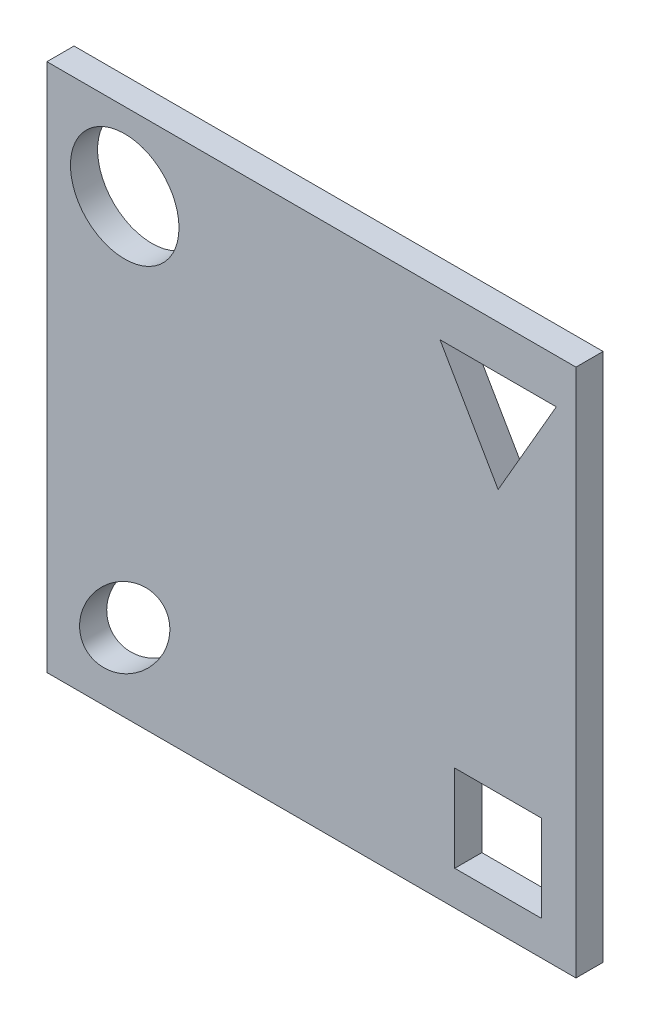
ISO-10303-21;
HEADER;
FILE_DESCRIPTION(('STEP AP214'),'2;1');
FILE_NAME('part.step','',(''),(''),'','','');
FILE_SCHEMA(('AUTOMOTIVE_DESIGN { 1 0 10303 214 1 1 1 1 }'));
ENDSEC;
DATA;
#1=APPLICATION_CONTEXT('core data for automotive mechanical design processes');
#2=APPLICATION_PROTOCOL_DEFINITION('international standard','automotive_design',2000,#1);
#3=PRODUCT_CONTEXT('',#1,'mechanical');
#4=PRODUCT('Part','Part','',(#3));
#5=PRODUCT_RELATED_PRODUCT_CATEGORY('part','',(#4));
#6=PRODUCT_DEFINITION_FORMATION('','',#4);
#7=PRODUCT_DEFINITION_CONTEXT('part definition',#1,'design');
#8=PRODUCT_DEFINITION('design','',#6,#7);
#9=PRODUCT_DEFINITION_SHAPE('','',#8);
#10=(LENGTH_UNIT() NAMED_UNIT(*) SI_UNIT(.MILLI.,.METRE.));
#11=(NAMED_UNIT(*) PLANE_ANGLE_UNIT() SI_UNIT($,.RADIAN.));
#12=(NAMED_UNIT(*) SI_UNIT($,.STERADIAN.) SOLID_ANGLE_UNIT());
#13=UNCERTAINTY_MEASURE_WITH_UNIT(LENGTH_MEASURE(1.E-05),#10,'distance_accuracy_value','');
#14=(GEOMETRIC_REPRESENTATION_CONTEXT(3) GLOBAL_UNCERTAINTY_ASSIGNED_CONTEXT((#13)) GLOBAL_UNIT_ASSIGNED_CONTEXT((#10,
#11,#12)) REPRESENTATION_CONTEXT('',''));
#15=CARTESIAN_POINT('',(0.,0.,0.));
#16=DIRECTION('',(0.,0.,1.));
#17=DIRECTION('',(1.,0.,0.));
#18=AXIS2_PLACEMENT_3D('',#15,#16,#17);
#19=CARTESIAN_POINT('',(0.,0.,10.));
#20=DIRECTION('',(0.,0.,-1.));
#21=DIRECTION('',(-1.,0.,0.));
#22=AXIS2_PLACEMENT_3D('',#19,#20,#21);
#23=PLANE('',#22);
#24=DIRECTION('',(0.5,-0.866025403784439,0.));
#25=VECTOR('',#24,1.);
#26=CARTESIAN_POINT('',(47.3872190144795,81.193497913769,10.));
#27=LINE('',#26,#25);
#28=CARTESIAN_POINT('',(47.3872190144795,81.193497913769,10.));
#29=VERTEX_POINT('',#28);
#30=CARTESIAN_POINT('',(68.8195410292072,44.0716272600836,10.));
#31=VERTEX_POINT('',#30);
#32=EDGE_CURVE('E156',#29,#31,#27,.T.);
#33=ORIENTED_EDGE('',*,*,#32,.F.);
#34=DIRECTION('',(-1.,0.,0.));
#35=VECTOR('',#34,1.);
#36=CARTESIAN_POINT('',(90.251863043935,81.193497913769,10.));
#37=LINE('',#36,#35);
#38=CARTESIAN_POINT('',(90.251863043935,81.193497913769,10.));
#39=VERTEX_POINT('',#38);
#40=EDGE_CURVE('E162',#39,#29,#37,.T.);
#41=ORIENTED_EDGE('',*,*,#40,.F.);
#42=DIRECTION('',(0.5,0.866025403784439,0.));
#43=VECTOR('',#42,1.);
#44=CARTESIAN_POINT('',(68.8195410292072,44.0716272600836,10.));
#45=LINE('',#44,#43);
#46=EDGE_CURVE('E158',#31,#39,#45,.T.);
#47=ORIENTED_EDGE('',*,*,#46,.F.);
#48=EDGE_LOOP('',(#33,#41,#47));
#49=FACE_BOUND('',#48,.T.);
#50=DIRECTION('',(0.,-1.,0.));
#51=VECTOR('',#50,1.);
#52=CARTESIAN_POINT('',(-97.5,97.5,10.));
#53=LINE('',#52,#51);
#54=CARTESIAN_POINT('',(-97.5,97.5,10.));
#55=VERTEX_POINT('',#54);
#56=CARTESIAN_POINT('',(-97.5,-97.5,10.));
#57=VERTEX_POINT('',#56);
#58=EDGE_CURVE('E239',#55,#57,#53,.T.);
#59=ORIENTED_EDGE('',*,*,#58,.T.);
#60=DIRECTION('',(1.,0.,0.));
#61=VECTOR('',#60,1.);
#62=CARTESIAN_POINT('',(97.5000000000001,-97.5,10.));
#63=LINE('',#62,#61);
#64=CARTESIAN_POINT('',(97.5000000000001,-97.5,10.));
#65=VERTEX_POINT('',#64);
#66=EDGE_CURVE('E253',#57,#65,#63,.T.);
#67=ORIENTED_EDGE('',*,*,#66,.T.);
#68=DIRECTION('',(0.,1.,0.));
#69=VECTOR('',#68,1.);
#70=CARTESIAN_POINT('',(97.5,97.5,10.));
#71=LINE('',#70,#69);
#72=CARTESIAN_POINT('',(97.5,97.5,10.));
#73=VERTEX_POINT('',#72);
#74=EDGE_CURVE('E233',#65,#73,#71,.T.);
#75=ORIENTED_EDGE('',*,*,#74,.T.);
#76=DIRECTION('',(-1.,0.,0.));
#77=VECTOR('',#76,1.);
#78=CARTESIAN_POINT('',(97.5,97.5,10.));
#79=LINE('',#78,#77);
#80=EDGE_CURVE('E246',#73,#55,#79,.T.);
#81=ORIENTED_EDGE('',*,*,#80,.T.);
#82=EDGE_LOOP('',(#59,#67,#75,#81));
#83=FACE_BOUND('',#82,.T.);
#84=CARTESIAN_POINT('',(-68.8195410292072,68.8195410292072,10.));
#85=DIRECTION('',(0.,0.,1.));
#86=DIRECTION('',(1.,0.,0.));
#87=AXIS2_PLACEMENT_3D('',#84,#85,#86);
#88=CIRCLE('',#87,20.);
#89=CARTESIAN_POINT('',(-48.8195410292072,68.8195410292072,10.));
#90=VERTEX_POINT('',#89);
#91=EDGE_CURVE('E256',#90,#90,#88,.T.);
#92=ORIENTED_EDGE('',*,*,#91,.F.);
#93=EDGE_LOOP('',(#92));
#94=FACE_BOUND('',#93,.T.);
#95=CARTESIAN_POINT('',(-68.8195410292072,-68.8195410292071,10.));
#96=DIRECTION('',(0.,0.,1.));
#97=DIRECTION('',(0.707106781186549,0.707106781186547,0.));
#98=AXIS2_PLACEMENT_3D('',#95,#96,#97);
#99=ELLIPSE('',#98,20.1363161958199,12.1776769374721);
#100=CARTESIAN_POINT('',(-54.5810152990264,-54.5810152990264,10.));
#101=VERTEX_POINT('',#100);
#102=EDGE_CURVE('E180',#101,#101,#99,.T.);
#103=ORIENTED_EDGE('',*,*,#102,.F.);
#104=EDGE_LOOP('',(#103));
#105=FACE_BOUND('',#104,.T.);
#106=DIRECTION('',(1.,0.,0.));
#107=VECTOR('',#106,1.);
#108=CARTESIAN_POINT('',(52.8181502086233,-84.8209318497915,10.));
#109=LINE('',#108,#107);
#110=CARTESIAN_POINT('',(52.8181502086233,-84.8209318497915,10.));
#111=VERTEX_POINT('',#110);
#112=CARTESIAN_POINT('',(84.8209318497914,-84.8209318497913,10.));
#113=VERTEX_POINT('',#112);
#114=EDGE_CURVE('E120',#111,#113,#109,.T.);
#115=ORIENTED_EDGE('',*,*,#114,.F.);
#116=DIRECTION('',(0.,-1.,0.));
#117=VECTOR('',#116,1.);
#118=CARTESIAN_POINT('',(52.818150208623,-52.8181502086232,10.));
#119=LINE('',#118,#117);
#120=CARTESIAN_POINT('',(52.818150208623,-52.8181502086232,10.));
#121=VERTEX_POINT('',#120);
#122=EDGE_CURVE('E142',#121,#111,#119,.T.);
#123=ORIENTED_EDGE('',*,*,#122,.F.);
#124=DIRECTION('',(-1.,0.,0.));
#125=VECTOR('',#124,1.);
#126=CARTESIAN_POINT('',(84.8209318497913,-52.818150208623,10.));
#127=LINE('',#126,#125);
#128=CARTESIAN_POINT('',(84.8209318497913,-52.818150208623,10.));
#129=VERTEX_POINT('',#128);
#130=EDGE_CURVE('E140',#129,#121,#127,.T.);
#131=ORIENTED_EDGE('',*,*,#130,.F.);
#132=DIRECTION('',(0.,1.,0.));
#133=VECTOR('',#132,1.);
#134=CARTESIAN_POINT('',(84.8209318497914,-84.8209318497913,10.));
#135=LINE('',#134,#133);
#136=EDGE_CURVE('E128',#113,#129,#135,.T.);
#137=ORIENTED_EDGE('',*,*,#136,.F.);
#138=EDGE_LOOP('',(#115,#123,#131,#137));
#139=FACE_BOUND('',#138,.T.);
#140=ADVANCED_FACE('F37',(#49,#83,#94,#105,#139),#23,.F.);
#141=CARTESIAN_POINT('',(0.,0.,0.));
#142=DIRECTION('',(0.,0.,-1.));
#143=DIRECTION('',(-1.,0.,0.));
#144=AXIS2_PLACEMENT_3D('',#141,#142,#143);
#145=PLANE('',#144);
#146=CARTESIAN_POINT('',(-68.8195410292072,68.8195410292072,0.));
#147=DIRECTION('',(0.,0.,1.));
#148=DIRECTION('',(1.,0.,0.));
#149=AXIS2_PLACEMENT_3D('',#146,#147,#148);
#150=CIRCLE('',#149,20.);
#151=CARTESIAN_POINT('',(-48.8195410292072,68.8195410292072,0.));
#152=VERTEX_POINT('',#151);
#153=EDGE_CURVE('E184',#152,#152,#150,.T.);
#154=ORIENTED_EDGE('',*,*,#153,.T.);
#155=EDGE_LOOP('',(#154));
#156=FACE_BOUND('',#155,.T.);
#157=DIRECTION('',(0.,-1.,0.));
#158=VECTOR('',#157,1.);
#159=CARTESIAN_POINT('',(-97.5,97.5,0.));
#160=LINE('',#159,#158);
#161=CARTESIAN_POINT('',(-97.5,97.5,0.));
#162=VERTEX_POINT('',#161);
#163=CARTESIAN_POINT('',(-97.5,-97.5,0.));
#164=VERTEX_POINT('',#163);
#165=EDGE_CURVE('E229',#162,#164,#160,.T.);
#166=ORIENTED_EDGE('',*,*,#165,.F.);
#167=DIRECTION('',(-1.,0.,0.));
#168=VECTOR('',#167,1.);
#169=CARTESIAN_POINT('',(97.5,97.5,0.));
#170=LINE('',#169,#168);
#171=CARTESIAN_POINT('',(97.5,97.5,0.));
#172=VERTEX_POINT('',#171);
#173=EDGE_CURVE('E237',#172,#162,#170,.T.);
#174=ORIENTED_EDGE('',*,*,#173,.F.);
#175=DIRECTION('',(0.,1.,0.));
#176=VECTOR('',#175,1.);
#177=CARTESIAN_POINT('',(97.5,97.5,0.));
#178=LINE('',#177,#176);
#179=CARTESIAN_POINT('',(97.5000000000001,-97.5,0.));
#180=VERTEX_POINT('',#179);
#181=EDGE_CURVE('E228',#180,#172,#178,.T.);
#182=ORIENTED_EDGE('',*,*,#181,.F.);
#183=DIRECTION('',(1.,0.,0.));
#184=VECTOR('',#183,1.);
#185=CARTESIAN_POINT('',(97.5000000000001,-97.5,0.));
#186=LINE('',#185,#184);
#187=EDGE_CURVE('E220',#164,#180,#186,.T.);
#188=ORIENTED_EDGE('',*,*,#187,.F.);
#189=EDGE_LOOP('',(#166,#174,#182,#188));
#190=FACE_BOUND('',#189,.T.);
#191=CARTESIAN_POINT('',(-68.8195410292072,-68.8195410292071,0.));
#192=DIRECTION('',(0.,0.,1.));
#193=DIRECTION('',(0.707106781186549,0.707106781186547,0.));
#194=AXIS2_PLACEMENT_3D('',#191,#192,#193);
#195=ELLIPSE('',#194,20.1363161958199,12.1776769374721);
#196=CARTESIAN_POINT('',(-54.5810152990264,-54.5810152990264,0.));
#197=VERTEX_POINT('',#196);
#198=EDGE_CURVE('E179',#197,#197,#195,.T.);
#199=ORIENTED_EDGE('',*,*,#198,.T.);
#200=EDGE_LOOP('',(#199));
#201=FACE_BOUND('',#200,.T.);
#202=DIRECTION('',(-1.,0.,0.));
#203=VECTOR('',#202,1.);
#204=CARTESIAN_POINT('',(90.251863043935,81.193497913769,0.));
#205=LINE('',#204,#203);
#206=CARTESIAN_POINT('',(90.251863043935,81.193497913769,0.));
#207=VERTEX_POINT('',#206);
#208=CARTESIAN_POINT('',(47.3872190144795,81.193497913769,0.));
#209=VERTEX_POINT('',#208);
#210=EDGE_CURVE('E159',#207,#209,#205,.T.);
#211=ORIENTED_EDGE('',*,*,#210,.T.);
#212=DIRECTION('',(0.5,-0.866025403784439,0.));
#213=VECTOR('',#212,1.);
#214=CARTESIAN_POINT('',(47.3872190144795,81.193497913769,0.));
#215=LINE('',#214,#213);
#216=CARTESIAN_POINT('',(68.8195410292072,44.0716272600836,0.));
#217=VERTEX_POINT('',#216);
#218=EDGE_CURVE('E136',#209,#217,#215,.T.);
#219=ORIENTED_EDGE('',*,*,#218,.T.);
#220=DIRECTION('',(0.5,0.866025403784439,0.));
#221=VECTOR('',#220,1.);
#222=CARTESIAN_POINT('',(68.8195410292072,44.0716272600836,0.));
#223=LINE('',#222,#221);
#224=EDGE_CURVE('E167',#217,#207,#223,.T.);
#225=ORIENTED_EDGE('',*,*,#224,.T.);
#226=EDGE_LOOP('',(#211,#219,#225));
#227=FACE_BOUND('',#226,.T.);
#228=DIRECTION('',(0.,-1.,0.));
#229=VECTOR('',#228,1.);
#230=CARTESIAN_POINT('',(52.818150208623,-52.8181502086232,0.));
#231=LINE('',#230,#229);
#232=CARTESIAN_POINT('',(52.818150208623,-52.8181502086232,0.));
#233=VERTEX_POINT('',#232);
#234=CARTESIAN_POINT('',(52.8181502086233,-84.8209318497915,0.));
#235=VERTEX_POINT('',#234);
#236=EDGE_CURVE('E129',#233,#235,#231,.T.);
#237=ORIENTED_EDGE('',*,*,#236,.T.);
#238=DIRECTION('',(1.,0.,0.));
#239=VECTOR('',#238,1.);
#240=CARTESIAN_POINT('',(52.8181502086233,-84.8209318497915,0.));
#241=LINE('',#240,#239);
#242=CARTESIAN_POINT('',(84.8209318497914,-84.8209318497913,0.));
#243=VERTEX_POINT('',#242);
#244=EDGE_CURVE('E60',#235,#243,#241,.T.);
#245=ORIENTED_EDGE('',*,*,#244,.T.);
#246=DIRECTION('',(0.,1.,0.));
#247=VECTOR('',#246,1.);
#248=CARTESIAN_POINT('',(84.8209318497914,-84.8209318497913,0.));
#249=LINE('',#248,#247);
#250=CARTESIAN_POINT('',(84.8209318497913,-52.818150208623,0.));
#251=VERTEX_POINT('',#250);
#252=EDGE_CURVE('E135',#243,#251,#249,.T.);
#253=ORIENTED_EDGE('',*,*,#252,.T.);
#254=DIRECTION('',(-1.,0.,0.));
#255=VECTOR('',#254,1.);
#256=CARTESIAN_POINT('',(84.8209318497913,-52.818150208623,0.));
#257=LINE('',#256,#255);
#258=EDGE_CURVE('E148',#251,#233,#257,.T.);
#259=ORIENTED_EDGE('',*,*,#258,.T.);
#260=EDGE_LOOP('',(#237,#245,#253,#259));
#261=FACE_BOUND('',#260,.T.);
#262=ADVANCED_FACE('F201',(#156,#190,#201,#227,#261),#145,.T.);
#263=CARTESIAN_POINT('',(-97.5,97.5,10.));
#264=DIRECTION('',(1.,0.,0.));
#265=DIRECTION('',(0.,0.,-1.));
#266=AXIS2_PLACEMENT_3D('',#263,#264,#265);
#267=PLANE('',#266);
#268=ORIENTED_EDGE('',*,*,#165,.T.);
#269=DIRECTION('',(0.,0.,-1.));
#270=VECTOR('',#269,1.);
#271=CARTESIAN_POINT('',(-97.5,-97.5,10.));
#272=LINE('',#271,#270);
#273=EDGE_CURVE('E11',#57,#164,#272,.T.);
#274=ORIENTED_EDGE('',*,*,#273,.F.);
#275=ORIENTED_EDGE('',*,*,#58,.F.);
#276=DIRECTION('',(0.,0.,-1.));
#277=VECTOR('',#276,1.);
#278=CARTESIAN_POINT('',(-97.5,97.5,10.));
#279=LINE('',#278,#277);
#280=EDGE_CURVE('E243',#55,#162,#279,.T.);
#281=ORIENTED_EDGE('',*,*,#280,.T.);
#282=EDGE_LOOP('',(#268,#274,#275,#281));
#283=FACE_BOUND('',#282,.T.);
#284=ADVANCED_FACE('F39',(#283),#267,.F.);
#285=CARTESIAN_POINT('',(97.5000000000001,-97.5,10.));
#286=DIRECTION('',(0.,1.,0.));
#287=DIRECTION('',(-1.,0.,0.));
#288=AXIS2_PLACEMENT_3D('',#285,#286,#287);
#289=PLANE('',#288);
#290=ORIENTED_EDGE('',*,*,#187,.T.);
#291=DIRECTION('',(0.,0.,-1.));
#292=VECTOR('',#291,1.);
#293=CARTESIAN_POINT('',(97.5000000000001,-97.5,10.));
#294=LINE('',#293,#292);
#295=EDGE_CURVE('E45',#65,#180,#294,.T.);
#296=ORIENTED_EDGE('',*,*,#295,.F.);
#297=ORIENTED_EDGE('',*,*,#66,.F.);
#298=ORIENTED_EDGE('',*,*,#273,.T.);
#299=EDGE_LOOP('',(#290,#296,#297,#298));
#300=FACE_BOUND('',#299,.T.);
#301=ADVANCED_FACE('F211',(#300),#289,.F.);
#302=CARTESIAN_POINT('',(97.5,97.5,10.));
#303=DIRECTION('',(-1.,0.,0.));
#304=DIRECTION('',(0.,-1.,0.));
#305=AXIS2_PLACEMENT_3D('',#302,#303,#304);
#306=PLANE('',#305);
#307=ORIENTED_EDGE('',*,*,#181,.T.);
#308=DIRECTION('',(0.,0.,-1.));
#309=VECTOR('',#308,1.);
#310=CARTESIAN_POINT('',(97.5,97.5,10.));
#311=LINE('',#310,#309);
#312=EDGE_CURVE('E234',#73,#172,#311,.T.);
#313=ORIENTED_EDGE('',*,*,#312,.F.);
#314=ORIENTED_EDGE('',*,*,#74,.F.);
#315=ORIENTED_EDGE('',*,*,#295,.T.);
#316=EDGE_LOOP('',(#307,#313,#314,#315));
#317=FACE_BOUND('',#316,.T.);
#318=ADVANCED_FACE('F208',(#317),#306,.F.);
#319=CARTESIAN_POINT('',(97.5,97.5,10.));
#320=DIRECTION('',(0.,-1.,0.));
#321=DIRECTION('',(1.,0.,0.));
#322=AXIS2_PLACEMENT_3D('',#319,#320,#321);
#323=PLANE('',#322);
#324=ORIENTED_EDGE('',*,*,#173,.T.);
#325=ORIENTED_EDGE('',*,*,#280,.F.);
#326=ORIENTED_EDGE('',*,*,#80,.F.);
#327=ORIENTED_EDGE('',*,*,#312,.T.);
#328=EDGE_LOOP('',(#324,#325,#326,#327));
#329=FACE_BOUND('',#328,.T.);
#330=ADVANCED_FACE('F197',(#329),#323,.F.);
#331=CARTESIAN_POINT('',(-68.8195410292072,68.8195410292072,10.));
#332=DIRECTION('',(0.,0.,-1.));
#333=DIRECTION('',(-1.,0.,0.));
#334=AXIS2_PLACEMENT_3D('',#331,#332,#333);
#335=CYLINDRICAL_SURFACE('',#334,20.);
#336=ORIENTED_EDGE('',*,*,#91,.T.);
#337=EDGE_LOOP('',(#336));
#338=FACE_BOUND('',#337,.T.);
#339=ORIENTED_EDGE('',*,*,#153,.F.);
#340=EDGE_LOOP('',(#339));
#341=FACE_BOUND('',#340,.T.);
#342=ADVANCED_FACE('F192',(#338,#341),#335,.F.);
#343=DIRECTION('',(0.,0.,-1.));
#344=VECTOR('',#343,1.);
#345=SURFACE_OF_LINEAR_EXTRUSION('',#99,#344);
#346=ORIENTED_EDGE('',*,*,#102,.T.);
#347=EDGE_LOOP('',(#346));
#348=FACE_BOUND('',#347,.T.);
#349=ORIENTED_EDGE('',*,*,#198,.F.);
#350=EDGE_LOOP('',(#349));
#351=FACE_BOUND('',#350,.T.);
#352=ADVANCED_FACE('F187',(#348,#351),#345,.T.);
#353=CARTESIAN_POINT('',(47.3872190144795,81.193497913769,10.));
#354=DIRECTION('',(0.866025403784439,0.5,0.));
#355=DIRECTION('',(-0.5,0.866025403784439,0.));
#356=AXIS2_PLACEMENT_3D('',#353,#354,#355);
#357=PLANE('',#356);
#358=ORIENTED_EDGE('',*,*,#218,.F.);
#359=DIRECTION('',(0.,0.,-1.));
#360=VECTOR('',#359,1.);
#361=CARTESIAN_POINT('',(47.3872190144795,81.193497913769,10.));
#362=LINE('',#361,#360);
#363=EDGE_CURVE('E164',#29,#209,#362,.T.);
#364=ORIENTED_EDGE('',*,*,#363,.F.);
#365=ORIENTED_EDGE('',*,*,#32,.T.);
#366=DIRECTION('',(0.,0.,-1.));
#367=VECTOR('',#366,1.);
#368=CARTESIAN_POINT('',(68.8195410292072,44.0716272600836,10.));
#369=LINE('',#368,#367);
#370=EDGE_CURVE('E176',#31,#217,#369,.T.);
#371=ORIENTED_EDGE('',*,*,#370,.T.);
#372=EDGE_LOOP('',(#358,#364,#365,#371));
#373=FACE_BOUND('',#372,.T.);
#374=ADVANCED_FACE('F191',(#373),#357,.T.);
#375=CARTESIAN_POINT('',(68.8195410292072,44.0716272600836,10.));
#376=DIRECTION('',(-0.866025403784439,0.5,0.));
#377=DIRECTION('',(-0.5,-0.866025403784439,0.));
#378=AXIS2_PLACEMENT_3D('',#375,#376,#377);
#379=PLANE('',#378);
#380=ORIENTED_EDGE('',*,*,#224,.F.);
#381=ORIENTED_EDGE('',*,*,#370,.F.);
#382=ORIENTED_EDGE('',*,*,#46,.T.);
#383=DIRECTION('',(0.,0.,-1.));
#384=VECTOR('',#383,1.);
#385=CARTESIAN_POINT('',(90.251863043935,81.193497913769,10.));
#386=LINE('',#385,#384);
#387=EDGE_CURVE('E174',#39,#207,#386,.T.);
#388=ORIENTED_EDGE('',*,*,#387,.T.);
#389=EDGE_LOOP('',(#380,#381,#382,#388));
#390=FACE_BOUND('',#389,.T.);
#391=ADVANCED_FACE('F288',(#390),#379,.T.);
#392=CARTESIAN_POINT('',(90.251863043935,81.193497913769,10.));
#393=DIRECTION('',(0.,-1.,0.));
#394=DIRECTION('',(1.,0.,0.));
#395=AXIS2_PLACEMENT_3D('',#392,#393,#394);
#396=PLANE('',#395);
#397=ORIENTED_EDGE('',*,*,#210,.F.);
#398=ORIENTED_EDGE('',*,*,#387,.F.);
#399=ORIENTED_EDGE('',*,*,#40,.T.);
#400=ORIENTED_EDGE('',*,*,#363,.T.);
#401=EDGE_LOOP('',(#397,#398,#399,#400));
#402=FACE_BOUND('',#401,.T.);
#403=ADVANCED_FACE('F286',(#402),#396,.T.);
#404=CARTESIAN_POINT('',(52.8181502086233,-84.8209318497915,10.));
#405=DIRECTION('',(0.,1.,0.));
#406=DIRECTION('',(-1.,0.,0.));
#407=AXIS2_PLACEMENT_3D('',#404,#405,#406);
#408=PLANE('',#407);
#409=ORIENTED_EDGE('',*,*,#244,.F.);
#410=DIRECTION('',(0.,0.,-1.));
#411=VECTOR('',#410,1.);
#412=CARTESIAN_POINT('',(52.8181502086233,-84.8209318497915,10.));
#413=LINE('',#412,#411);
#414=EDGE_CURVE('E124',#111,#235,#413,.T.);
#415=ORIENTED_EDGE('',*,*,#414,.F.);
#416=ORIENTED_EDGE('',*,*,#114,.T.);
#417=DIRECTION('',(0.,0.,-1.));
#418=VECTOR('',#417,1.);
#419=CARTESIAN_POINT('',(84.8209318497914,-84.8209318497913,10.));
#420=LINE('',#419,#418);
#421=EDGE_CURVE('E123',#113,#243,#420,.T.);
#422=ORIENTED_EDGE('',*,*,#421,.T.);
#423=EDGE_LOOP('',(#409,#415,#416,#422));
#424=FACE_BOUND('',#423,.T.);
#425=ADVANCED_FACE('F122',(#424),#408,.T.);
#426=CARTESIAN_POINT('',(84.8209318497914,-84.8209318497913,10.));
#427=DIRECTION('',(-1.,0.,0.));
#428=DIRECTION('',(0.,-1.,0.));
#429=AXIS2_PLACEMENT_3D('',#426,#427,#428);
#430=PLANE('',#429);
#431=ORIENTED_EDGE('',*,*,#252,.F.);
#432=ORIENTED_EDGE('',*,*,#421,.F.);
#433=ORIENTED_EDGE('',*,*,#136,.T.);
#434=DIRECTION('',(0.,0.,-1.));
#435=VECTOR('',#434,1.);
#436=CARTESIAN_POINT('',(84.8209318497913,-52.818150208623,10.));
#437=LINE('',#436,#435);
#438=EDGE_CURVE('E137',#129,#251,#437,.T.);
#439=ORIENTED_EDGE('',*,*,#438,.T.);
#440=EDGE_LOOP('',(#431,#432,#433,#439));
#441=FACE_BOUND('',#440,.T.);
#442=ADVANCED_FACE('F132',(#441),#430,.T.);
#443=CARTESIAN_POINT('',(84.8209318497913,-52.818150208623,10.));
#444=DIRECTION('',(0.,-1.,0.));
#445=DIRECTION('',(1.,0.,0.));
#446=AXIS2_PLACEMENT_3D('',#443,#444,#445);
#447=PLANE('',#446);
#448=ORIENTED_EDGE('',*,*,#258,.F.);
#449=ORIENTED_EDGE('',*,*,#438,.F.);
#450=ORIENTED_EDGE('',*,*,#130,.T.);
#451=DIRECTION('',(0.,0.,-1.));
#452=VECTOR('',#451,1.);
#453=CARTESIAN_POINT('',(52.818150208623,-52.8181502086232,10.));
#454=LINE('',#453,#452);
#455=EDGE_CURVE('E52',#121,#233,#454,.T.);
#456=ORIENTED_EDGE('',*,*,#455,.T.);
#457=EDGE_LOOP('',(#448,#449,#450,#456));
#458=FACE_BOUND('',#457,.T.);
#459=ADVANCED_FACE('F274',(#458),#447,.T.);
#460=CARTESIAN_POINT('',(52.818150208623,-52.8181502086232,10.));
#461=DIRECTION('',(1.,0.,0.));
#462=DIRECTION('',(0.,1.,0.));
#463=AXIS2_PLACEMENT_3D('',#460,#461,#462);
#464=PLANE('',#463);
#465=ORIENTED_EDGE('',*,*,#236,.F.);
#466=ORIENTED_EDGE('',*,*,#455,.F.);
#467=ORIENTED_EDGE('',*,*,#122,.T.);
#468=ORIENTED_EDGE('',*,*,#414,.T.);
#469=EDGE_LOOP('',(#465,#466,#467,#468));
#470=FACE_BOUND('',#469,.T.);
#471=ADVANCED_FACE('F272',(#470),#464,.T.);
#472=CLOSED_SHELL('',(#140,#262,#284,#301,#318,#330,#342,#352,#374,#391,#403,#425,#442,#459,#471));
#473=MANIFOLD_SOLID_BREP('B2',#472);
#474=ADVANCED_BREP_SHAPE_REPRESENTATION('',(#18,#473),#14);
#475=SHAPE_DEFINITION_REPRESENTATION(#9,#474);
ENDSEC;
END-ISO-10303-21;
